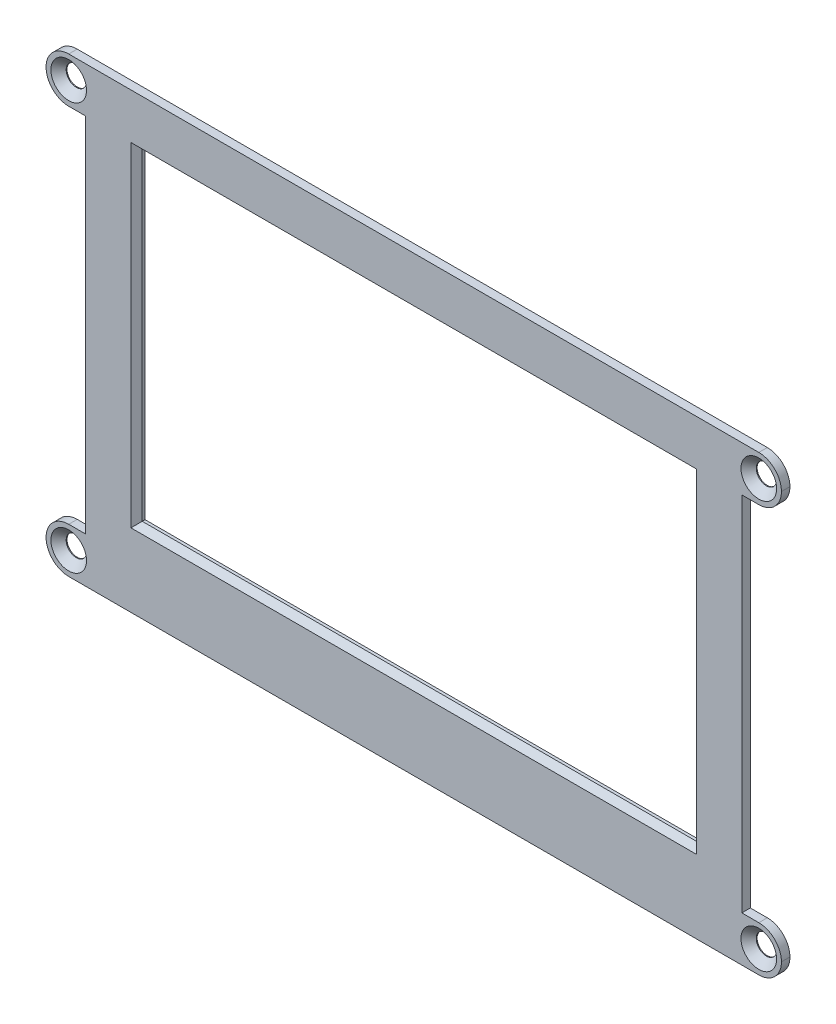
ISO-10303-21;
HEADER;
FILE_DESCRIPTION(('STEP AP214'),'2;1');
FILE_NAME('part.step','',(''),(''),'','','');
FILE_SCHEMA(('AUTOMOTIVE_DESIGN { 1 0 10303 214 1 1 1 1 }'));
ENDSEC;
DATA;
#1=APPLICATION_CONTEXT('core data for automotive mechanical design processes');
#2=APPLICATION_PROTOCOL_DEFINITION('international standard','automotive_design',2000,#1);
#3=PRODUCT_CONTEXT('',#1,'mechanical');
#4=PRODUCT('Part','Part','',(#3));
#5=PRODUCT_RELATED_PRODUCT_CATEGORY('part','',(#4));
#6=PRODUCT_DEFINITION_FORMATION('','',#4);
#7=PRODUCT_DEFINITION_CONTEXT('part definition',#1,'design');
#8=PRODUCT_DEFINITION('design','',#6,#7);
#9=PRODUCT_DEFINITION_SHAPE('','',#8);
#10=(LENGTH_UNIT() NAMED_UNIT(*) SI_UNIT(.MILLI.,.METRE.));
#11=(NAMED_UNIT(*) PLANE_ANGLE_UNIT() SI_UNIT($,.RADIAN.));
#12=(NAMED_UNIT(*) SI_UNIT($,.STERADIAN.) SOLID_ANGLE_UNIT());
#13=UNCERTAINTY_MEASURE_WITH_UNIT(LENGTH_MEASURE(1.E-05),#10,'distance_accuracy_value','');
#14=(GEOMETRIC_REPRESENTATION_CONTEXT(3) GLOBAL_UNCERTAINTY_ASSIGNED_CONTEXT((#13)) GLOBAL_UNIT_ASSIGNED_CONTEXT((#10,
#11,#12)) REPRESENTATION_CONTEXT('',''));
#15=CARTESIAN_POINT('',(0.,0.,0.));
#16=DIRECTION('',(0.,0.,1.));
#17=DIRECTION('',(1.,0.,0.));
#18=AXIS2_PLACEMENT_3D('',#15,#16,#17);
#19=CARTESIAN_POINT('',(0.,0.,1.5));
#20=DIRECTION('',(0.,0.,1.));
#21=DIRECTION('',(1.,0.,0.));
#22=AXIS2_PLACEMENT_3D('',#19,#20,#21);
#23=PLANE('',#22);
#24=DIRECTION('',(-1.,0.,0.));
#25=VECTOR('',#24,1.);
#26=CARTESIAN_POINT('',(-49.,-27.05,1.5));
#27=LINE('',#26,#25);
#28=CARTESIAN_POINT('',(50.,-27.05,1.5));
#29=VERTEX_POINT('',#28);
#30=CARTESIAN_POINT('',(-50.,-27.05,1.5));
#31=VERTEX_POINT('',#30);
#32=EDGE_CURVE('E377',#29,#31,#27,.T.);
#33=ORIENTED_EDGE('',*,*,#32,.T.);
#34=DIRECTION('',(0.,1.,0.));
#35=VECTOR('',#34,1.);
#36=CARTESIAN_POINT('',(-50.,30.95,1.5));
#37=LINE('',#36,#35);
#38=CARTESIAN_POINT('',(-50.,31.95,1.5));
#39=VERTEX_POINT('',#38);
#40=EDGE_CURVE('E383',#31,#39,#37,.T.);
#41=ORIENTED_EDGE('',*,*,#40,.T.);
#42=DIRECTION('',(1.,0.,0.));
#43=VECTOR('',#42,1.);
#44=CARTESIAN_POINT('',(49.,31.95,1.5));
#45=LINE('',#44,#43);
#46=CARTESIAN_POINT('',(50.,31.95,1.5));
#47=VERTEX_POINT('',#46);
#48=EDGE_CURVE('E381',#39,#47,#45,.T.);
#49=ORIENTED_EDGE('',*,*,#48,.T.);
#50=DIRECTION('',(0.,-1.,0.));
#51=VECTOR('',#50,1.);
#52=CARTESIAN_POINT('',(50.,-26.05,1.5));
#53=LINE('',#52,#51);
#54=EDGE_CURVE('E379',#47,#29,#53,.T.);
#55=ORIENTED_EDGE('',*,*,#54,.T.);
#56=EDGE_LOOP('',(#33,#41,#49,#55));
#57=FACE_BOUND('',#56,.T.);
#58=CARTESIAN_POINT('',(61.,-36.,1.5));
#59=DIRECTION('',(0.,0.,1.));
#60=DIRECTION('',(1.,0.,0.));
#61=AXIS2_PLACEMENT_3D('',#58,#59,#60);
#62=CIRCLE('',#61,3.15);
#63=CARTESIAN_POINT('',(64.15,-36.,1.5));
#64=VERTEX_POINT('',#63);
#65=EDGE_CURVE('E231',#64,#64,#62,.T.);
#66=ORIENTED_EDGE('',*,*,#65,.F.);
#67=EDGE_LOOP('',(#66));
#68=FACE_BOUND('',#67,.T.);
#69=CARTESIAN_POINT('',(-61.,-36.,1.5));
#70=DIRECTION('',(0.,0.,1.));
#71=DIRECTION('',(1.,0.,0.));
#72=AXIS2_PLACEMENT_3D('',#69,#70,#71);
#73=CIRCLE('',#72,3.15);
#74=CARTESIAN_POINT('',(-57.85,-36.,1.5));
#75=VERTEX_POINT('',#74);
#76=EDGE_CURVE('E245',#75,#75,#73,.T.);
#77=ORIENTED_EDGE('',*,*,#76,.F.);
#78=EDGE_LOOP('',(#77));
#79=FACE_BOUND('',#78,.T.);
#80=CARTESIAN_POINT('',(61.,36.,1.5));
#81=DIRECTION('',(0.,0.,1.));
#82=DIRECTION('',(1.,0.,0.));
#83=AXIS2_PLACEMENT_3D('',#80,#81,#82);
#84=CIRCLE('',#83,3.15);
#85=CARTESIAN_POINT('',(64.15,36.,1.5));
#86=VERTEX_POINT('',#85);
#87=EDGE_CURVE('E254',#86,#86,#84,.T.);
#88=ORIENTED_EDGE('',*,*,#87,.F.);
#89=EDGE_LOOP('',(#88));
#90=FACE_BOUND('',#89,.T.);
#91=CARTESIAN_POINT('',(-61.,36.,1.5));
#92=DIRECTION('',(0.,0.,1.));
#93=DIRECTION('',(1.,0.,0.));
#94=AXIS2_PLACEMENT_3D('',#91,#92,#93);
#95=CIRCLE('',#94,3.15);
#96=CARTESIAN_POINT('',(-57.85,36.,1.5));
#97=VERTEX_POINT('',#96);
#98=EDGE_CURVE('E263',#97,#97,#95,.T.);
#99=ORIENTED_EDGE('',*,*,#98,.F.);
#100=EDGE_LOOP('',(#99));
#101=FACE_BOUND('',#100,.T.);
#102=DIRECTION('',(-1.,0.,0.));
#103=VECTOR('',#102,1.);
#104=CARTESIAN_POINT('',(-58.,-32.,1.5));
#105=LINE('',#104,#103);
#106=CARTESIAN_POINT('',(-58.,-32.,1.5));
#107=VERTEX_POINT('',#106);
#108=CARTESIAN_POINT('',(-61.,-32.,1.5));
#109=VERTEX_POINT('',#108);
#110=EDGE_CURVE('E194',#107,#109,#105,.T.);
#111=ORIENTED_EDGE('',*,*,#110,.T.);
#112=CARTESIAN_POINT('',(-61.,-36.,1.5));
#113=DIRECTION('',(0.,0.,1.));
#114=DIRECTION('',(1.,0.,0.));
#115=AXIS2_PLACEMENT_3D('',#112,#113,#114);
#116=CIRCLE('',#115,4.);
#117=CARTESIAN_POINT('',(-65.,-36.,1.5));
#118=VERTEX_POINT('',#117);
#119=EDGE_CURVE('E357',#109,#118,#116,.T.);
#120=ORIENTED_EDGE('',*,*,#119,.T.);
#121=CARTESIAN_POINT('',(-61.,-36.,1.5));
#122=DIRECTION('',(0.,0.,1.));
#123=DIRECTION('',(1.,0.,0.));
#124=AXIS2_PLACEMENT_3D('',#121,#122,#123);
#125=CIRCLE('',#124,4.);
#126=CARTESIAN_POINT('',(-61.,-40.,1.5));
#127=VERTEX_POINT('',#126);
#128=EDGE_CURVE('E307',#118,#127,#125,.T.);
#129=ORIENTED_EDGE('',*,*,#128,.T.);
#130=DIRECTION('',(1.,0.,0.));
#131=VECTOR('',#130,1.);
#132=CARTESIAN_POINT('',(-65.,-40.,1.5));
#133=LINE('',#132,#131);
#134=CARTESIAN_POINT('',(61.,-40.,1.5));
#135=VERTEX_POINT('',#134);
#136=EDGE_CURVE('E276',#127,#135,#133,.T.);
#137=ORIENTED_EDGE('',*,*,#136,.T.);
#138=CARTESIAN_POINT('',(61.,-36.,1.5));
#139=DIRECTION('',(0.,0.,1.));
#140=DIRECTION('',(1.,0.,0.));
#141=AXIS2_PLACEMENT_3D('',#138,#139,#140);
#142=CIRCLE('',#141,4.);
#143=CARTESIAN_POINT('',(65.,-36.,1.5));
#144=VERTEX_POINT('',#143);
#145=EDGE_CURVE('E309',#135,#144,#142,.T.);
#146=ORIENTED_EDGE('',*,*,#145,.T.);
#147=CARTESIAN_POINT('',(61.,-36.,1.5));
#148=DIRECTION('',(0.,0.,1.));
#149=DIRECTION('',(1.,0.,0.));
#150=AXIS2_PLACEMENT_3D('',#147,#148,#149);
#151=CIRCLE('',#150,4.);
#152=CARTESIAN_POINT('',(61.,-32.,1.5));
#153=VERTEX_POINT('',#152);
#154=EDGE_CURVE('E354',#144,#153,#151,.T.);
#155=ORIENTED_EDGE('',*,*,#154,.T.);
#156=DIRECTION('',(1.,0.,0.));
#157=VECTOR('',#156,1.);
#158=CARTESIAN_POINT('',(58.,-32.,1.5));
#159=LINE('',#158,#157);
#160=CARTESIAN_POINT('',(58.,-32.,1.5));
#161=VERTEX_POINT('',#160);
#162=EDGE_CURVE('E217',#161,#153,#159,.T.);
#163=ORIENTED_EDGE('',*,*,#162,.F.);
#164=DIRECTION('',(0.,-1.,0.));
#165=VECTOR('',#164,1.);
#166=CARTESIAN_POINT('',(58.,32.,1.5));
#167=LINE('',#166,#165);
#168=CARTESIAN_POINT('',(58.,32.,1.5));
#169=VERTEX_POINT('',#168);
#170=EDGE_CURVE('E213',#169,#161,#167,.T.);
#171=ORIENTED_EDGE('',*,*,#170,.F.);
#172=DIRECTION('',(-1.,0.,0.));
#173=VECTOR('',#172,1.);
#174=CARTESIAN_POINT('',(58.,32.,1.5));
#175=LINE('',#174,#173);
#176=CARTESIAN_POINT('',(61.,32.,1.5));
#177=VERTEX_POINT('',#176);
#178=EDGE_CURVE('E220',#177,#169,#175,.T.);
#179=ORIENTED_EDGE('',*,*,#178,.F.);
#180=CARTESIAN_POINT('',(61.,36.,1.5));
#181=DIRECTION('',(0.,0.,1.));
#182=DIRECTION('',(1.,0.,0.));
#183=AXIS2_PLACEMENT_3D('',#180,#181,#182);
#184=CIRCLE('',#183,4.);
#185=CARTESIAN_POINT('',(65.,36.,1.5));
#186=VERTEX_POINT('',#185);
#187=EDGE_CURVE('E352',#177,#186,#184,.T.);
#188=ORIENTED_EDGE('',*,*,#187,.T.);
#189=CARTESIAN_POINT('',(61.,36.,1.5));
#190=DIRECTION('',(0.,0.,1.));
#191=DIRECTION('',(1.,0.,0.));
#192=AXIS2_PLACEMENT_3D('',#189,#190,#191);
#193=CIRCLE('',#192,4.);
#194=CARTESIAN_POINT('',(61.,40.,1.5));
#195=VERTEX_POINT('',#194);
#196=EDGE_CURVE('E305',#186,#195,#193,.T.);
#197=ORIENTED_EDGE('',*,*,#196,.T.);
#198=DIRECTION('',(-1.,0.,0.));
#199=VECTOR('',#198,1.);
#200=CARTESIAN_POINT('',(-65.,40.,1.5));
#201=LINE('',#200,#199);
#202=CARTESIAN_POINT('',(-61.,40.,1.5));
#203=VERTEX_POINT('',#202);
#204=EDGE_CURVE('E273',#195,#203,#201,.T.);
#205=ORIENTED_EDGE('',*,*,#204,.T.);
#206=CARTESIAN_POINT('',(-61.,36.,1.5));
#207=DIRECTION('',(0.,0.,1.));
#208=DIRECTION('',(1.,0.,0.));
#209=AXIS2_PLACEMENT_3D('',#206,#207,#208);
#210=CIRCLE('',#209,4.);
#211=CARTESIAN_POINT('',(-65.,36.,1.5));
#212=VERTEX_POINT('',#211);
#213=EDGE_CURVE('E303',#203,#212,#210,.T.);
#214=ORIENTED_EDGE('',*,*,#213,.T.);
#215=CARTESIAN_POINT('',(-61.,36.,1.5));
#216=DIRECTION('',(0.,0.,1.));
#217=DIRECTION('',(1.,0.,0.));
#218=AXIS2_PLACEMENT_3D('',#215,#216,#217);
#219=CIRCLE('',#218,4.);
#220=CARTESIAN_POINT('',(-61.,32.,1.5));
#221=VERTEX_POINT('',#220);
#222=EDGE_CURVE('E191',#212,#221,#219,.T.);
#223=ORIENTED_EDGE('',*,*,#222,.T.);
#224=DIRECTION('',(1.,0.,0.));
#225=VECTOR('',#224,1.);
#226=CARTESIAN_POINT('',(-58.,32.,1.5));
#227=LINE('',#226,#225);
#228=CARTESIAN_POINT('',(-58.,32.,1.5));
#229=VERTEX_POINT('',#228);
#230=EDGE_CURVE('E185',#221,#229,#227,.T.);
#231=ORIENTED_EDGE('',*,*,#230,.T.);
#232=DIRECTION('',(0.,-1.,0.));
#233=VECTOR('',#232,1.);
#234=CARTESIAN_POINT('',(-58.,32.,1.5));
#235=LINE('',#234,#233);
#236=EDGE_CURVE('E189',#229,#107,#235,.T.);
#237=ORIENTED_EDGE('',*,*,#236,.T.);
#238=EDGE_LOOP('',(#111,#120,#129,#137,#146,#155,#163,#171,#179,#188,#197,#205,#214,#223,#231,#237));
#239=FACE_BOUND('',#238,.T.);
#240=ADVANCED_FACE('F35',(#57,#68,#79,#90,#101,#239),#23,.T.);
#241=CARTESIAN_POINT('',(0.,0.,0.));
#242=DIRECTION('',(0.,0.,1.));
#243=DIRECTION('',(1.,0.,0.));
#244=AXIS2_PLACEMENT_3D('',#241,#242,#243);
#245=PLANE('',#244);
#246=CARTESIAN_POINT('',(-61.,36.,0.));
#247=DIRECTION('',(0.,0.,1.));
#248=DIRECTION('',(1.,0.,0.));
#249=AXIS2_PLACEMENT_3D('',#246,#247,#248);
#250=CIRCLE('',#249,1.8);
#251=CARTESIAN_POINT('',(-59.2,36.,0.));
#252=VERTEX_POINT('',#251);
#253=EDGE_CURVE('E269',#252,#252,#250,.T.);
#254=ORIENTED_EDGE('',*,*,#253,.T.);
#255=EDGE_LOOP('',(#254));
#256=FACE_BOUND('',#255,.T.);
#257=CARTESIAN_POINT('',(61.,36.,0.));
#258=DIRECTION('',(0.,0.,1.));
#259=DIRECTION('',(1.,0.,0.));
#260=AXIS2_PLACEMENT_3D('',#257,#258,#259);
#261=CIRCLE('',#260,1.8);
#262=CARTESIAN_POINT('',(62.8,36.,0.));
#263=VERTEX_POINT('',#262);
#264=EDGE_CURVE('E260',#263,#263,#261,.T.);
#265=ORIENTED_EDGE('',*,*,#264,.T.);
#266=EDGE_LOOP('',(#265));
#267=FACE_BOUND('',#266,.T.);
#268=CARTESIAN_POINT('',(-61.,-36.,0.));
#269=DIRECTION('',(0.,0.,1.));
#270=DIRECTION('',(1.,0.,0.));
#271=AXIS2_PLACEMENT_3D('',#268,#269,#270);
#272=CIRCLE('',#271,1.8);
#273=CARTESIAN_POINT('',(-59.2,-36.,0.));
#274=VERTEX_POINT('',#273);
#275=EDGE_CURVE('E251',#274,#274,#272,.T.);
#276=ORIENTED_EDGE('',*,*,#275,.T.);
#277=EDGE_LOOP('',(#276));
#278=FACE_BOUND('',#277,.T.);
#279=CARTESIAN_POINT('',(61.,-36.,0.));
#280=DIRECTION('',(0.,0.,1.));
#281=DIRECTION('',(1.,0.,0.));
#282=AXIS2_PLACEMENT_3D('',#279,#280,#281);
#283=CIRCLE('',#282,1.8);
#284=CARTESIAN_POINT('',(62.8,-36.,0.));
#285=VERTEX_POINT('',#284);
#286=EDGE_CURVE('E242',#285,#285,#283,.T.);
#287=ORIENTED_EDGE('',*,*,#286,.T.);
#288=EDGE_LOOP('',(#287));
#289=FACE_BOUND('',#288,.T.);
#290=DIRECTION('',(-1.,0.,0.));
#291=VECTOR('',#290,1.);
#292=CARTESIAN_POINT('',(0.,30.95,0.));
#293=LINE('',#292,#291);
#294=CARTESIAN_POINT('',(49.,30.95,0.));
#295=VERTEX_POINT('',#294);
#296=CARTESIAN_POINT('',(-49.,30.95,0.));
#297=VERTEX_POINT('',#296);
#298=EDGE_CURVE('E329',#295,#297,#293,.T.);
#299=ORIENTED_EDGE('',*,*,#298,.T.);
#300=DIRECTION('',(0.,-1.,0.));
#301=VECTOR('',#300,1.);
#302=CARTESIAN_POINT('',(-49.,0.,0.));
#303=LINE('',#302,#301);
#304=CARTESIAN_POINT('',(-49.,-26.05,0.));
#305=VERTEX_POINT('',#304);
#306=EDGE_CURVE('E332',#297,#305,#303,.T.);
#307=ORIENTED_EDGE('',*,*,#306,.T.);
#308=DIRECTION('',(1.,0.,0.));
#309=VECTOR('',#308,1.);
#310=CARTESIAN_POINT('',(0.,-26.05,0.));
#311=LINE('',#310,#309);
#312=CARTESIAN_POINT('',(49.,-26.05,0.));
#313=VERTEX_POINT('',#312);
#314=EDGE_CURVE('E323',#305,#313,#311,.T.);
#315=ORIENTED_EDGE('',*,*,#314,.T.);
#316=DIRECTION('',(0.,1.,0.));
#317=VECTOR('',#316,1.);
#318=CARTESIAN_POINT('',(49.,0.,0.));
#319=LINE('',#318,#317);
#320=EDGE_CURVE('E326',#313,#295,#319,.T.);
#321=ORIENTED_EDGE('',*,*,#320,.T.);
#322=EDGE_LOOP('',(#299,#307,#315,#321));
#323=FACE_BOUND('',#322,.T.);
#324=CARTESIAN_POINT('',(-61.,-36.,0.));
#325=DIRECTION('',(0.,0.,1.));
#326=DIRECTION('',(1.,0.,0.));
#327=AXIS2_PLACEMENT_3D('',#324,#325,#326);
#328=CIRCLE('',#327,4.);
#329=CARTESIAN_POINT('',(-61.,-40.,0.));
#330=VERTEX_POINT('',#329);
#331=CARTESIAN_POINT('',(-65.,-36.,0.));
#332=VERTEX_POINT('',#331);
#333=EDGE_CURVE('E294',#330,#332,#328,.F.);
#334=ORIENTED_EDGE('',*,*,#333,.T.);
#335=CARTESIAN_POINT('',(-61.,-36.,0.));
#336=DIRECTION('',(0.,0.,1.));
#337=DIRECTION('',(1.,0.,0.));
#338=AXIS2_PLACEMENT_3D('',#335,#336,#337);
#339=CIRCLE('',#338,4.);
#340=CARTESIAN_POINT('',(-61.,-32.,0.));
#341=VERTEX_POINT('',#340);
#342=EDGE_CURVE('E365',#332,#341,#339,.F.);
#343=ORIENTED_EDGE('',*,*,#342,.T.);
#344=DIRECTION('',(-1.,0.,0.));
#345=VECTOR('',#344,1.);
#346=CARTESIAN_POINT('',(0.,-32.,0.));
#347=LINE('',#346,#345);
#348=CARTESIAN_POINT('',(-58.,-32.,0.));
#349=VERTEX_POINT('',#348);
#350=EDGE_CURVE('E346',#349,#341,#347,.T.);
#351=ORIENTED_EDGE('',*,*,#350,.F.);
#352=DIRECTION('',(0.,-1.,0.));
#353=VECTOR('',#352,1.);
#354=CARTESIAN_POINT('',(-58.,0.,0.));
#355=LINE('',#354,#353);
#356=CARTESIAN_POINT('',(-58.,32.,0.));
#357=VERTEX_POINT('',#356);
#358=EDGE_CURVE('E344',#357,#349,#355,.T.);
#359=ORIENTED_EDGE('',*,*,#358,.F.);
#360=DIRECTION('',(1.,0.,0.));
#361=VECTOR('',#360,1.);
#362=CARTESIAN_POINT('',(0.,32.,0.));
#363=LINE('',#362,#361);
#364=CARTESIAN_POINT('',(-61.,32.,0.));
#365=VERTEX_POINT('',#364);
#366=EDGE_CURVE('E200',#365,#357,#363,.T.);
#367=ORIENTED_EDGE('',*,*,#366,.F.);
#368=CARTESIAN_POINT('',(-61.,36.,0.));
#369=DIRECTION('',(0.,0.,1.));
#370=DIRECTION('',(1.,0.,0.));
#371=AXIS2_PLACEMENT_3D('',#368,#369,#370);
#372=CIRCLE('',#371,4.);
#373=CARTESIAN_POINT('',(-65.,36.,0.));
#374=VERTEX_POINT('',#373);
#375=EDGE_CURVE('E363',#365,#374,#372,.F.);
#376=ORIENTED_EDGE('',*,*,#375,.T.);
#377=CARTESIAN_POINT('',(-61.,36.,0.));
#378=DIRECTION('',(0.,0.,1.));
#379=DIRECTION('',(1.,0.,0.));
#380=AXIS2_PLACEMENT_3D('',#377,#378,#379);
#381=CIRCLE('',#380,4.);
#382=CARTESIAN_POINT('',(-61.,40.,0.));
#383=VERTEX_POINT('',#382);
#384=EDGE_CURVE('E290',#374,#383,#381,.F.);
#385=ORIENTED_EDGE('',*,*,#384,.T.);
#386=DIRECTION('',(-1.,0.,0.));
#387=VECTOR('',#386,1.);
#388=CARTESIAN_POINT('',(-65.,40.,0.));
#389=LINE('',#388,#387);
#390=CARTESIAN_POINT('',(61.,40.,0.));
#391=VERTEX_POINT('',#390);
#392=EDGE_CURVE('E272',#391,#383,#389,.T.);
#393=ORIENTED_EDGE('',*,*,#392,.F.);
#394=CARTESIAN_POINT('',(61.,36.,0.));
#395=DIRECTION('',(0.,0.,1.));
#396=DIRECTION('',(1.,0.,0.));
#397=AXIS2_PLACEMENT_3D('',#394,#395,#396);
#398=CIRCLE('',#397,4.);
#399=CARTESIAN_POINT('',(65.,36.,0.));
#400=VERTEX_POINT('',#399);
#401=EDGE_CURVE('E292',#391,#400,#398,.F.);
#402=ORIENTED_EDGE('',*,*,#401,.T.);
#403=CARTESIAN_POINT('',(61.,36.,0.));
#404=DIRECTION('',(0.,0.,1.));
#405=DIRECTION('',(1.,0.,0.));
#406=AXIS2_PLACEMENT_3D('',#403,#404,#405);
#407=CIRCLE('',#406,4.);
#408=CARTESIAN_POINT('',(61.,32.,0.));
#409=VERTEX_POINT('',#408);
#410=EDGE_CURVE('E359',#400,#409,#407,.F.);
#411=ORIENTED_EDGE('',*,*,#410,.T.);
#412=DIRECTION('',(-1.,0.,0.));
#413=VECTOR('',#412,1.);
#414=CARTESIAN_POINT('',(0.,32.,0.));
#415=LINE('',#414,#413);
#416=CARTESIAN_POINT('',(58.,32.,0.));
#417=VERTEX_POINT('',#416);
#418=EDGE_CURVE('E341',#409,#417,#415,.T.);
#419=ORIENTED_EDGE('',*,*,#418,.T.);
#420=DIRECTION('',(0.,-1.,0.));
#421=VECTOR('',#420,1.);
#422=CARTESIAN_POINT('',(58.,0.,0.));
#423=LINE('',#422,#421);
#424=CARTESIAN_POINT('',(58.,-32.,0.));
#425=VERTEX_POINT('',#424);
#426=EDGE_CURVE('E338',#417,#425,#423,.T.);
#427=ORIENTED_EDGE('',*,*,#426,.T.);
#428=DIRECTION('',(1.,0.,0.));
#429=VECTOR('',#428,1.);
#430=CARTESIAN_POINT('',(0.,-32.,0.));
#431=LINE('',#430,#429);
#432=CARTESIAN_POINT('',(61.,-32.,0.));
#433=VERTEX_POINT('',#432);
#434=EDGE_CURVE('E335',#425,#433,#431,.T.);
#435=ORIENTED_EDGE('',*,*,#434,.T.);
#436=CARTESIAN_POINT('',(61.,-36.,0.));
#437=DIRECTION('',(0.,0.,1.));
#438=DIRECTION('',(1.,0.,0.));
#439=AXIS2_PLACEMENT_3D('',#436,#437,#438);
#440=CIRCLE('',#439,4.);
#441=CARTESIAN_POINT('',(65.,-36.,0.));
#442=VERTEX_POINT('',#441);
#443=EDGE_CURVE('E361',#433,#442,#440,.F.);
#444=ORIENTED_EDGE('',*,*,#443,.T.);
#445=CARTESIAN_POINT('',(61.,-36.,0.));
#446=DIRECTION('',(0.,0.,1.));
#447=DIRECTION('',(1.,0.,0.));
#448=AXIS2_PLACEMENT_3D('',#445,#446,#447);
#449=CIRCLE('',#448,4.);
#450=CARTESIAN_POINT('',(61.,-40.,0.));
#451=VERTEX_POINT('',#450);
#452=EDGE_CURVE('E296',#442,#451,#449,.F.);
#453=ORIENTED_EDGE('',*,*,#452,.T.);
#454=DIRECTION('',(1.,0.,0.));
#455=VECTOR('',#454,1.);
#456=CARTESIAN_POINT('',(-65.,-40.,0.));
#457=LINE('',#456,#455);
#458=EDGE_CURVE('E277',#330,#451,#457,.T.);
#459=ORIENTED_EDGE('',*,*,#458,.F.);
#460=EDGE_LOOP('',(#334,#343,#351,#359,#367,#376,#385,#393,#402,#411,#419,#427,#435,#444,#453,#459));
#461=FACE_BOUND('',#460,.T.);
#462=ADVANCED_FACE('F414',(#256,#267,#278,#289,#323,#461),#245,.F.);
#463=CARTESIAN_POINT('',(-65.,40.,1.5));
#464=DIRECTION('',(0.,-1.,0.));
#465=DIRECTION('',(0.,0.,-1.));
#466=AXIS2_PLACEMENT_3D('',#463,#464,#465);
#467=PLANE('',#466);
#468=ORIENTED_EDGE('',*,*,#204,.F.);
#469=DIRECTION('',(0.,0.,-1.));
#470=VECTOR('',#469,1.);
#471=CARTESIAN_POINT('',(61.,40.,1.5));
#472=LINE('',#471,#470);
#473=EDGE_CURVE('E320',#195,#391,#472,.T.);
#474=ORIENTED_EDGE('',*,*,#473,.T.);
#475=ORIENTED_EDGE('',*,*,#392,.T.);
#476=DIRECTION('',(0.,0.,-1.));
#477=VECTOR('',#476,1.);
#478=CARTESIAN_POINT('',(-61.,40.,1.5));
#479=LINE('',#478,#477);
#480=EDGE_CURVE('E318',#383,#203,#479,.F.);
#481=ORIENTED_EDGE('',*,*,#480,.T.);
#482=EDGE_LOOP('',(#468,#474,#475,#481));
#483=FACE_BOUND('',#482,.T.);
#484=ADVANCED_FACE('F437',(#483),#467,.F.);
#485=CARTESIAN_POINT('',(-65.,-40.,1.5));
#486=DIRECTION('',(0.,1.,0.));
#487=DIRECTION('',(0.,0.,1.));
#488=AXIS2_PLACEMENT_3D('',#485,#486,#487);
#489=PLANE('',#488);
#490=ORIENTED_EDGE('',*,*,#458,.T.);
#491=DIRECTION('',(0.,0.,-1.));
#492=VECTOR('',#491,1.);
#493=CARTESIAN_POINT('',(61.,-40.,1.5));
#494=LINE('',#493,#492);
#495=EDGE_CURVE('E301',#451,#135,#494,.F.);
#496=ORIENTED_EDGE('',*,*,#495,.T.);
#497=ORIENTED_EDGE('',*,*,#136,.F.);
#498=DIRECTION('',(0.,0.,-1.));
#499=VECTOR('',#498,1.);
#500=CARTESIAN_POINT('',(-61.,-40.,1.5));
#501=LINE('',#500,#499);
#502=EDGE_CURVE('E298',#127,#330,#501,.T.);
#503=ORIENTED_EDGE('',*,*,#502,.T.);
#504=EDGE_LOOP('',(#490,#496,#497,#503));
#505=FACE_BOUND('',#504,.T.);
#506=ADVANCED_FACE('F445',(#505),#489,.F.);
#507=CARTESIAN_POINT('',(61.,-36.,1.5));
#508=DIRECTION('',(0.,0.,-1.));
#509=DIRECTION('',(-1.,0.,0.));
#510=AXIS2_PLACEMENT_3D('',#507,#508,#509);
#511=CYLINDRICAL_SURFACE('',#510,4.);
#512=ORIENTED_EDGE('',*,*,#145,.F.);
#513=ORIENTED_EDGE('',*,*,#495,.F.);
#514=ORIENTED_EDGE('',*,*,#452,.F.);
#515=DIRECTION('',(0.,0.,-1.));
#516=VECTOR('',#515,1.);
#517=CARTESIAN_POINT('',(65.,-36.,1.5));
#518=LINE('',#517,#516);
#519=EDGE_CURVE('E287',#144,#442,#518,.T.);
#520=ORIENTED_EDGE('',*,*,#519,.F.);
#521=EDGE_LOOP('',(#512,#513,#514,#520));
#522=FACE_BOUND('',#521,.T.);
#523=ADVANCED_FACE('F448',(#522),#511,.T.);
#524=CARTESIAN_POINT('',(-61.,-36.,1.5));
#525=DIRECTION('',(0.,0.,-1.));
#526=DIRECTION('',(-1.,0.,0.));
#527=AXIS2_PLACEMENT_3D('',#524,#525,#526);
#528=CYLINDRICAL_SURFACE('',#527,4.);
#529=ORIENTED_EDGE('',*,*,#128,.F.);
#530=DIRECTION('',(0.,0.,-1.));
#531=VECTOR('',#530,1.);
#532=CARTESIAN_POINT('',(-65.,-36.,1.5));
#533=LINE('',#532,#531);
#534=EDGE_CURVE('E315',#332,#118,#533,.F.);
#535=ORIENTED_EDGE('',*,*,#534,.F.);
#536=ORIENTED_EDGE('',*,*,#333,.F.);
#537=ORIENTED_EDGE('',*,*,#502,.F.);
#538=EDGE_LOOP('',(#529,#535,#536,#537));
#539=FACE_BOUND('',#538,.T.);
#540=ADVANCED_FACE('F455',(#539),#528,.T.);
#541=CARTESIAN_POINT('',(61.,36.,1.5));
#542=DIRECTION('',(0.,0.,-1.));
#543=DIRECTION('',(-1.,0.,0.));
#544=AXIS2_PLACEMENT_3D('',#541,#542,#543);
#545=CYLINDRICAL_SURFACE('',#544,4.);
#546=ORIENTED_EDGE('',*,*,#196,.F.);
#547=DIRECTION('',(0.,0.,-1.));
#548=VECTOR('',#547,1.);
#549=CARTESIAN_POINT('',(65.,36.,1.5));
#550=LINE('',#549,#548);
#551=EDGE_CURVE('E280',#400,#186,#550,.F.);
#552=ORIENTED_EDGE('',*,*,#551,.F.);
#553=ORIENTED_EDGE('',*,*,#401,.F.);
#554=ORIENTED_EDGE('',*,*,#473,.F.);
#555=EDGE_LOOP('',(#546,#552,#553,#554));
#556=FACE_BOUND('',#555,.T.);
#557=ADVANCED_FACE('F459',(#556),#545,.T.);
#558=CARTESIAN_POINT('',(-61.,36.,1.5));
#559=DIRECTION('',(0.,0.,-1.));
#560=DIRECTION('',(-1.,0.,0.));
#561=AXIS2_PLACEMENT_3D('',#558,#559,#560);
#562=CYLINDRICAL_SURFACE('',#561,4.);
#563=ORIENTED_EDGE('',*,*,#213,.F.);
#564=ORIENTED_EDGE('',*,*,#480,.F.);
#565=ORIENTED_EDGE('',*,*,#384,.F.);
#566=DIRECTION('',(0.,0.,-1.));
#567=VECTOR('',#566,1.);
#568=CARTESIAN_POINT('',(-65.,36.,1.5));
#569=LINE('',#568,#567);
#570=EDGE_CURVE('E312',#212,#374,#569,.T.);
#571=ORIENTED_EDGE('',*,*,#570,.F.);
#572=EDGE_LOOP('',(#563,#564,#565,#571));
#573=FACE_BOUND('',#572,.T.);
#574=ADVANCED_FACE('F463',(#573),#562,.T.);
#575=CARTESIAN_POINT('',(-61.,36.,1.5));
#576=DIRECTION('',(0.,0.,1.));
#577=DIRECTION('',(1.,0.,0.));
#578=AXIS2_PLACEMENT_3D('',#575,#576,#577);
#579=CYLINDRICAL_SURFACE('',#578,1.8);
#580=ORIENTED_EDGE('',*,*,#253,.F.);
#581=EDGE_LOOP('',(#580));
#582=FACE_BOUND('',#581,.T.);
#583=CARTESIAN_POINT('',(-61.,36.,0.15));
#584=DIRECTION('',(0.,0.,1.));
#585=DIRECTION('',(1.,0.,0.));
#586=AXIS2_PLACEMENT_3D('',#583,#584,#585);
#587=CIRCLE('',#586,1.8);
#588=CARTESIAN_POINT('',(-59.2,36.,0.15));
#589=VERTEX_POINT('',#588);
#590=EDGE_CURVE('E266',#589,#589,#587,.T.);
#591=ORIENTED_EDGE('',*,*,#590,.T.);
#592=EDGE_LOOP('',(#591));
#593=FACE_BOUND('',#592,.T.);
#594=ADVANCED_FACE('F442',(#582,#593),#579,.F.);
#595=CARTESIAN_POINT('',(-61.,36.,1.5));
#596=DIRECTION('',(0.,0.,1.));
#597=DIRECTION('',(1.,0.,0.));
#598=AXIS2_PLACEMENT_3D('',#595,#596,#597);
#599=CONICAL_SURFACE('',#598,3.15,0.78539816339745);
#600=ORIENTED_EDGE('',*,*,#590,.F.);
#601=EDGE_LOOP('',(#600));
#602=FACE_BOUND('',#601,.T.);
#603=ORIENTED_EDGE('',*,*,#98,.T.);
#604=EDGE_LOOP('',(#603));
#605=FACE_BOUND('',#604,.T.);
#606=ADVANCED_FACE('F615',(#602,#605),#599,.F.);
#607=CARTESIAN_POINT('',(61.,36.,1.5));
#608=DIRECTION('',(0.,0.,1.));
#609=DIRECTION('',(1.,0.,0.));
#610=AXIS2_PLACEMENT_3D('',#607,#608,#609);
#611=CYLINDRICAL_SURFACE('',#610,1.8);
#612=ORIENTED_EDGE('',*,*,#264,.F.);
#613=EDGE_LOOP('',(#612));
#614=FACE_BOUND('',#613,.T.);
#615=CARTESIAN_POINT('',(61.,36.,0.15));
#616=DIRECTION('',(0.,0.,1.));
#617=DIRECTION('',(1.,0.,0.));
#618=AXIS2_PLACEMENT_3D('',#615,#616,#617);
#619=CIRCLE('',#618,1.8);
#620=CARTESIAN_POINT('',(62.8,36.,0.15));
#621=VERTEX_POINT('',#620);
#622=EDGE_CURVE('E257',#621,#621,#619,.T.);
#623=ORIENTED_EDGE('',*,*,#622,.T.);
#624=EDGE_LOOP('',(#623));
#625=FACE_BOUND('',#624,.T.);
#626=ADVANCED_FACE('F605',(#614,#625),#611,.F.);
#627=CARTESIAN_POINT('',(61.,36.,1.5));
#628=DIRECTION('',(0.,0.,1.));
#629=DIRECTION('',(1.,0.,0.));
#630=AXIS2_PLACEMENT_3D('',#627,#628,#629);
#631=CONICAL_SURFACE('',#630,3.15,0.78539816339745);
#632=ORIENTED_EDGE('',*,*,#622,.F.);
#633=EDGE_LOOP('',(#632));
#634=FACE_BOUND('',#633,.T.);
#635=ORIENTED_EDGE('',*,*,#87,.T.);
#636=EDGE_LOOP('',(#635));
#637=FACE_BOUND('',#636,.T.);
#638=ADVANCED_FACE('F595',(#634,#637),#631,.F.);
#639=CARTESIAN_POINT('',(-61.,-36.,1.5));
#640=DIRECTION('',(0.,0.,1.));
#641=DIRECTION('',(1.,0.,0.));
#642=AXIS2_PLACEMENT_3D('',#639,#640,#641);
#643=CYLINDRICAL_SURFACE('',#642,1.8);
#644=ORIENTED_EDGE('',*,*,#275,.F.);
#645=EDGE_LOOP('',(#644));
#646=FACE_BOUND('',#645,.T.);
#647=CARTESIAN_POINT('',(-61.,-36.,0.15));
#648=DIRECTION('',(0.,0.,1.));
#649=DIRECTION('',(1.,0.,0.));
#650=AXIS2_PLACEMENT_3D('',#647,#648,#649);
#651=CIRCLE('',#650,1.8);
#652=CARTESIAN_POINT('',(-59.2,-36.,0.15));
#653=VERTEX_POINT('',#652);
#654=EDGE_CURVE('E248',#653,#653,#651,.T.);
#655=ORIENTED_EDGE('',*,*,#654,.T.);
#656=EDGE_LOOP('',(#655));
#657=FACE_BOUND('',#656,.T.);
#658=ADVANCED_FACE('F585',(#646,#657),#643,.F.);
#659=CARTESIAN_POINT('',(-61.,-36.,1.5));
#660=DIRECTION('',(0.,0.,1.));
#661=DIRECTION('',(1.,0.,0.));
#662=AXIS2_PLACEMENT_3D('',#659,#660,#661);
#663=CONICAL_SURFACE('',#662,3.15,0.78539816339745);
#664=ORIENTED_EDGE('',*,*,#654,.F.);
#665=EDGE_LOOP('',(#664));
#666=FACE_BOUND('',#665,.T.);
#667=ORIENTED_EDGE('',*,*,#76,.T.);
#668=EDGE_LOOP('',(#667));
#669=FACE_BOUND('',#668,.T.);
#670=ADVANCED_FACE('F575',(#666,#669),#663,.F.);
#671=CARTESIAN_POINT('',(61.,-36.,1.5));
#672=DIRECTION('',(0.,0.,1.));
#673=DIRECTION('',(1.,0.,0.));
#674=AXIS2_PLACEMENT_3D('',#671,#672,#673);
#675=CYLINDRICAL_SURFACE('',#674,1.8);
#676=ORIENTED_EDGE('',*,*,#286,.F.);
#677=EDGE_LOOP('',(#676));
#678=FACE_BOUND('',#677,.T.);
#679=CARTESIAN_POINT('',(61.,-36.,0.15));
#680=DIRECTION('',(0.,0.,1.));
#681=DIRECTION('',(1.,0.,0.));
#682=AXIS2_PLACEMENT_3D('',#679,#680,#681);
#683=CIRCLE('',#682,1.8);
#684=CARTESIAN_POINT('',(62.8,-36.,0.15));
#685=VERTEX_POINT('',#684);
#686=EDGE_CURVE('E239',#685,#685,#683,.T.);
#687=ORIENTED_EDGE('',*,*,#686,.T.);
#688=EDGE_LOOP('',(#687));
#689=FACE_BOUND('',#688,.T.);
#690=ADVANCED_FACE('F563',(#678,#689),#675,.F.);
#691=CARTESIAN_POINT('',(61.,-36.,1.5));
#692=DIRECTION('',(0.,0.,1.));
#693=DIRECTION('',(1.,0.,0.));
#694=AXIS2_PLACEMENT_3D('',#691,#692,#693);
#695=CONICAL_SURFACE('',#694,3.15,0.78539816339745);
#696=ORIENTED_EDGE('',*,*,#686,.F.);
#697=EDGE_LOOP('',(#696));
#698=FACE_BOUND('',#697,.T.);
#699=ORIENTED_EDGE('',*,*,#65,.T.);
#700=EDGE_LOOP('',(#699));
#701=FACE_BOUND('',#700,.T.);
#702=ADVANCED_FACE('F558',(#698,#701),#695,.F.);
#703=CARTESIAN_POINT('',(-49.,30.95,-4.5));
#704=DIRECTION('',(-1.,0.,0.));
#705=DIRECTION('',(0.,-1.,0.));
#706=AXIS2_PLACEMENT_3D('',#703,#704,#705);
#707=PLANE('',#706);
#708=DIRECTION('',(0.,0.,1.));
#709=VECTOR('',#708,1.);
#710=CARTESIAN_POINT('',(-49.,30.95,-4.5));
#711=LINE('',#710,#709);
#712=CARTESIAN_POINT('',(-49.,30.95,0.499999999999985));
#713=VERTEX_POINT('',#712);
#714=EDGE_CURVE('E228',#297,#713,#711,.T.);
#715=ORIENTED_EDGE('',*,*,#714,.T.);
#716=DIRECTION('',(0.,-1.,0.));
#717=VECTOR('',#716,1.);
#718=CARTESIAN_POINT('',(-49.,-26.05,0.499999999999985));
#719=LINE('',#718,#717);
#720=CARTESIAN_POINT('',(-49.,-26.05,0.499999999999985));
#721=VERTEX_POINT('',#720);
#722=EDGE_CURVE('E374',#713,#721,#719,.T.);
#723=ORIENTED_EDGE('',*,*,#722,.T.);
#724=DIRECTION('',(0.,0.,1.));
#725=VECTOR('',#724,1.);
#726=CARTESIAN_POINT('',(-49.,-26.05,-4.5));
#727=LINE('',#726,#725);
#728=EDGE_CURVE('E226',#305,#721,#727,.T.);
#729=ORIENTED_EDGE('',*,*,#728,.F.);
#730=ORIENTED_EDGE('',*,*,#306,.F.);
#731=EDGE_LOOP('',(#715,#723,#729,#730));
#732=FACE_BOUND('',#731,.T.);
#733=ADVANCED_FACE('F411',(#732),#707,.F.);
#734=CARTESIAN_POINT('',(49.,30.95,-4.5));
#735=DIRECTION('',(0.,1.,0.));
#736=DIRECTION('',(-1.,0.,0.));
#737=AXIS2_PLACEMENT_3D('',#734,#735,#736);
#738=PLANE('',#737);
#739=DIRECTION('',(0.,0.,1.));
#740=VECTOR('',#739,1.);
#741=CARTESIAN_POINT('',(49.,30.95,-4.5));
#742=LINE('',#741,#740);
#743=CARTESIAN_POINT('',(49.,30.95,0.499999999999985));
#744=VERTEX_POINT('',#743);
#745=EDGE_CURVE('E232',#295,#744,#742,.T.);
#746=ORIENTED_EDGE('',*,*,#745,.T.);
#747=DIRECTION('',(-1.,0.,0.));
#748=VECTOR('',#747,1.);
#749=CARTESIAN_POINT('',(-49.,30.95,0.499999999999985));
#750=LINE('',#749,#748);
#751=EDGE_CURVE('E386',#744,#713,#750,.T.);
#752=ORIENTED_EDGE('',*,*,#751,.T.);
#753=ORIENTED_EDGE('',*,*,#714,.F.);
#754=ORIENTED_EDGE('',*,*,#298,.F.);
#755=EDGE_LOOP('',(#746,#752,#753,#754));
#756=FACE_BOUND('',#755,.T.);
#757=ADVANCED_FACE('F409',(#756),#738,.F.);
#758=CARTESIAN_POINT('',(49.,30.95,-4.5));
#759=DIRECTION('',(1.,0.,0.));
#760=DIRECTION('',(0.,1.,0.));
#761=AXIS2_PLACEMENT_3D('',#758,#759,#760);
#762=PLANE('',#761);
#763=DIRECTION('',(0.,0.,1.));
#764=VECTOR('',#763,1.);
#765=CARTESIAN_POINT('',(49.,-26.05,-4.5));
#766=LINE('',#765,#764);
#767=CARTESIAN_POINT('',(49.,-26.05,0.499999999999985));
#768=VERTEX_POINT('',#767);
#769=EDGE_CURVE('E234',#313,#768,#766,.T.);
#770=ORIENTED_EDGE('',*,*,#769,.T.);
#771=DIRECTION('',(0.,1.,0.));
#772=VECTOR('',#771,1.);
#773=CARTESIAN_POINT('',(49.,30.95,0.499999999999985));
#774=LINE('',#773,#772);
#775=EDGE_CURVE('E44',#768,#744,#774,.T.);
#776=ORIENTED_EDGE('',*,*,#775,.T.);
#777=ORIENTED_EDGE('',*,*,#745,.F.);
#778=ORIENTED_EDGE('',*,*,#320,.F.);
#779=EDGE_LOOP('',(#770,#776,#777,#778));
#780=FACE_BOUND('',#779,.T.);
#781=ADVANCED_FACE('F417',(#780),#762,.F.);
#782=CARTESIAN_POINT('',(49.,-26.05,-4.5));
#783=DIRECTION('',(0.,-1.,0.));
#784=DIRECTION('',(1.,0.,0.));
#785=AXIS2_PLACEMENT_3D('',#782,#783,#784);
#786=PLANE('',#785);
#787=ORIENTED_EDGE('',*,*,#728,.T.);
#788=DIRECTION('',(1.,0.,0.));
#789=VECTOR('',#788,1.);
#790=CARTESIAN_POINT('',(49.,-26.05,0.499999999999985));
#791=LINE('',#790,#789);
#792=EDGE_CURVE('E11',#721,#768,#791,.T.);
#793=ORIENTED_EDGE('',*,*,#792,.T.);
#794=ORIENTED_EDGE('',*,*,#769,.F.);
#795=ORIENTED_EDGE('',*,*,#314,.F.);
#796=EDGE_LOOP('',(#787,#793,#794,#795));
#797=FACE_BOUND('',#796,.T.);
#798=ADVANCED_FACE('F418',(#797),#786,.F.);
#799=CARTESIAN_POINT('',(58.,32.,-8.5));
#800=DIRECTION('',(-1.,0.,0.));
#801=DIRECTION('',(0.,-1.,0.));
#802=AXIS2_PLACEMENT_3D('',#799,#800,#801);
#803=PLANE('',#802);
#804=DIRECTION('',(0.,0.,1.));
#805=VECTOR('',#804,1.);
#806=CARTESIAN_POINT('',(58.,32.,-8.5));
#807=LINE('',#806,#805);
#808=EDGE_CURVE('E223',#417,#169,#807,.T.);
#809=ORIENTED_EDGE('',*,*,#808,.T.);
#810=ORIENTED_EDGE('',*,*,#170,.T.);
#811=DIRECTION('',(0.,0.,1.));
#812=VECTOR('',#811,1.);
#813=CARTESIAN_POINT('',(58.,-32.,-8.5));
#814=LINE('',#813,#812);
#815=EDGE_CURVE('E222',#425,#161,#814,.T.);
#816=ORIENTED_EDGE('',*,*,#815,.F.);
#817=ORIENTED_EDGE('',*,*,#426,.F.);
#818=EDGE_LOOP('',(#809,#810,#816,#817));
#819=FACE_BOUND('',#818,.T.);
#820=ADVANCED_FACE('F420',(#819),#803,.F.);
#821=CARTESIAN_POINT('',(58.,32.,-8.5));
#822=DIRECTION('',(0.,1.,0.));
#823=DIRECTION('',(0.,0.,1.));
#824=AXIS2_PLACEMENT_3D('',#821,#822,#823);
#825=PLANE('',#824);
#826=ORIENTED_EDGE('',*,*,#418,.F.);
#827=DIRECTION('',(0.,0.,1.));
#828=VECTOR('',#827,1.);
#829=CARTESIAN_POINT('',(61.,32.,-8.5));
#830=LINE('',#829,#828);
#831=EDGE_CURVE('E371',#409,#177,#830,.T.);
#832=ORIENTED_EDGE('',*,*,#831,.T.);
#833=ORIENTED_EDGE('',*,*,#178,.T.);
#834=ORIENTED_EDGE('',*,*,#808,.F.);
#835=EDGE_LOOP('',(#826,#832,#833,#834));
#836=FACE_BOUND('',#835,.T.);
#837=ADVANCED_FACE('F426',(#836),#825,.F.);
#838=CARTESIAN_POINT('',(58.,-32.,-8.5));
#839=DIRECTION('',(0.,-1.,0.));
#840=DIRECTION('',(0.,0.,-1.));
#841=AXIS2_PLACEMENT_3D('',#838,#839,#840);
#842=PLANE('',#841);
#843=ORIENTED_EDGE('',*,*,#162,.T.);
#844=DIRECTION('',(0.,0.,1.));
#845=VECTOR('',#844,1.);
#846=CARTESIAN_POINT('',(61.,-32.,-8.5));
#847=LINE('',#846,#845);
#848=EDGE_CURVE('E369',#153,#433,#847,.F.);
#849=ORIENTED_EDGE('',*,*,#848,.T.);
#850=ORIENTED_EDGE('',*,*,#434,.F.);
#851=ORIENTED_EDGE('',*,*,#815,.T.);
#852=EDGE_LOOP('',(#843,#849,#850,#851));
#853=FACE_BOUND('',#852,.T.);
#854=ADVANCED_FACE('F532',(#853),#842,.F.);
#855=CARTESIAN_POINT('',(-58.,32.,-8.5));
#856=DIRECTION('',(-1.,0.,0.));
#857=DIRECTION('',(0.,-1.,0.));
#858=AXIS2_PLACEMENT_3D('',#855,#856,#857);
#859=PLANE('',#858);
#860=ORIENTED_EDGE('',*,*,#358,.T.);
#861=DIRECTION('',(0.,0.,1.));
#862=VECTOR('',#861,1.);
#863=CARTESIAN_POINT('',(-58.,-32.,-8.5));
#864=LINE('',#863,#862);
#865=EDGE_CURVE('E203',#349,#107,#864,.T.);
#866=ORIENTED_EDGE('',*,*,#865,.T.);
#867=ORIENTED_EDGE('',*,*,#236,.F.);
#868=DIRECTION('',(0.,0.,1.));
#869=VECTOR('',#868,1.);
#870=CARTESIAN_POINT('',(-58.,32.,-8.5));
#871=LINE('',#870,#869);
#872=EDGE_CURVE('E197',#357,#229,#871,.T.);
#873=ORIENTED_EDGE('',*,*,#872,.F.);
#874=EDGE_LOOP('',(#860,#866,#867,#873));
#875=FACE_BOUND('',#874,.T.);
#876=ADVANCED_FACE('F205',(#875),#859,.T.);
#877=CARTESIAN_POINT('',(-58.,-32.,-8.5));
#878=DIRECTION('',(0.,1.,0.));
#879=DIRECTION('',(0.,0.,1.));
#880=AXIS2_PLACEMENT_3D('',#877,#878,#879);
#881=PLANE('',#880);
#882=ORIENTED_EDGE('',*,*,#350,.T.);
#883=DIRECTION('',(0.,0.,1.));
#884=VECTOR('',#883,1.);
#885=CARTESIAN_POINT('',(-61.,-32.,1.5));
#886=LINE('',#885,#884);
#887=EDGE_CURVE('E349',#341,#109,#886,.T.);
#888=ORIENTED_EDGE('',*,*,#887,.T.);
#889=ORIENTED_EDGE('',*,*,#110,.F.);
#890=ORIENTED_EDGE('',*,*,#865,.F.);
#891=EDGE_LOOP('',(#882,#888,#889,#890));
#892=FACE_BOUND('',#891,.T.);
#893=ADVANCED_FACE('F517',(#892),#881,.T.);
#894=CARTESIAN_POINT('',(-58.,32.,-8.5));
#895=DIRECTION('',(0.,-1.,0.));
#896=DIRECTION('',(0.,0.,-1.));
#897=AXIS2_PLACEMENT_3D('',#894,#895,#896);
#898=PLANE('',#897);
#899=ORIENTED_EDGE('',*,*,#230,.F.);
#900=DIRECTION('',(0.,0.,1.));
#901=VECTOR('',#900,1.);
#902=CARTESIAN_POINT('',(-61.,32.,0.));
#903=LINE('',#902,#901);
#904=EDGE_CURVE('E367',#221,#365,#903,.F.);
#905=ORIENTED_EDGE('',*,*,#904,.T.);
#906=ORIENTED_EDGE('',*,*,#366,.T.);
#907=ORIENTED_EDGE('',*,*,#872,.T.);
#908=EDGE_LOOP('',(#899,#905,#906,#907));
#909=FACE_BOUND('',#908,.T.);
#910=ADVANCED_FACE('F198',(#909),#898,.T.);
#911=CARTESIAN_POINT('',(-61.,-36.,-8.5));
#912=DIRECTION('',(0.,0.,-1.));
#913=DIRECTION('',(-1.,0.,0.));
#914=AXIS2_PLACEMENT_3D('',#911,#912,#913);
#915=CYLINDRICAL_SURFACE('',#914,4.);
#916=ORIENTED_EDGE('',*,*,#342,.F.);
#917=ORIENTED_EDGE('',*,*,#534,.T.);
#918=ORIENTED_EDGE('',*,*,#119,.F.);
#919=ORIENTED_EDGE('',*,*,#887,.F.);
#920=EDGE_LOOP('',(#916,#917,#918,#919));
#921=FACE_BOUND('',#920,.T.);
#922=ADVANCED_FACE('F468',(#921),#915,.T.);
#923=CARTESIAN_POINT('',(-61.,36.,1.5));
#924=DIRECTION('',(0.,0.,-1.));
#925=DIRECTION('',(-1.,0.,0.));
#926=AXIS2_PLACEMENT_3D('',#923,#924,#925);
#927=CYLINDRICAL_SURFACE('',#926,4.);
#928=ORIENTED_EDGE('',*,*,#375,.F.);
#929=ORIENTED_EDGE('',*,*,#904,.F.);
#930=ORIENTED_EDGE('',*,*,#222,.F.);
#931=ORIENTED_EDGE('',*,*,#570,.T.);
#932=EDGE_LOOP('',(#928,#929,#930,#931));
#933=FACE_BOUND('',#932,.T.);
#934=ADVANCED_FACE('F471',(#933),#927,.T.);
#935=CARTESIAN_POINT('',(61.,-36.,1.5));
#936=DIRECTION('',(0.,0.,1.));
#937=DIRECTION('',(1.,0.,0.));
#938=AXIS2_PLACEMENT_3D('',#935,#936,#937);
#939=CYLINDRICAL_SURFACE('',#938,4.);
#940=ORIENTED_EDGE('',*,*,#443,.F.);
#941=ORIENTED_EDGE('',*,*,#848,.F.);
#942=ORIENTED_EDGE('',*,*,#154,.F.);
#943=ORIENTED_EDGE('',*,*,#519,.T.);
#944=EDGE_LOOP('',(#940,#941,#942,#943));
#945=FACE_BOUND('',#944,.T.);
#946=ADVANCED_FACE('F475',(#945),#939,.T.);
#947=CARTESIAN_POINT('',(61.,36.,-8.5));
#948=DIRECTION('',(0.,0.,1.));
#949=DIRECTION('',(1.,0.,0.));
#950=AXIS2_PLACEMENT_3D('',#947,#948,#949);
#951=CYLINDRICAL_SURFACE('',#950,4.);
#952=ORIENTED_EDGE('',*,*,#410,.F.);
#953=ORIENTED_EDGE('',*,*,#551,.T.);
#954=ORIENTED_EDGE('',*,*,#187,.F.);
#955=ORIENTED_EDGE('',*,*,#831,.F.);
#956=EDGE_LOOP('',(#952,#953,#954,#955));
#957=FACE_BOUND('',#956,.T.);
#958=ADVANCED_FACE('F479',(#957),#951,.T.);
#959=CARTESIAN_POINT('',(49.,30.95,0.499999999999985));
#960=DIRECTION('',(-0.707106781186539,0.,0.707106781186556));
#961=DIRECTION('',(0.,-1.,0.));
#962=AXIS2_PLACEMENT_3D('',#959,#960,#961);
#963=PLANE('',#962);
#964=DIRECTION('',(-0.577350269189632,0.577350269189626,-0.577350269189619));
#965=VECTOR('',#964,1.);
#966=CARTESIAN_POINT('',(29.9999999999998,-7.04999999999995,-18.4999999999998));
#967=LINE('',#966,#965);
#968=EDGE_CURVE('E210',#29,#768,#967,.T.);
#969=ORIENTED_EDGE('',*,*,#968,.F.);
#970=ORIENTED_EDGE('',*,*,#54,.F.);
#971=DIRECTION('',(-0.577350269189632,-0.577350269189627,-0.577350269189619));
#972=VECTOR('',#971,1.);
#973=CARTESIAN_POINT('',(49.,30.95,0.499999999999985));
#974=LINE('',#973,#972);
#975=EDGE_CURVE('E39',#744,#47,#974,.F.);
#976=ORIENTED_EDGE('',*,*,#975,.F.);
#977=ORIENTED_EDGE('',*,*,#775,.F.);
#978=EDGE_LOOP('',(#969,#970,#976,#977));
#979=FACE_BOUND('',#978,.T.);
#980=ADVANCED_FACE('F37',(#979),#963,.T.);
#981=CARTESIAN_POINT('',(49.,30.95,0.499999999999985));
#982=DIRECTION('',(0.,-0.707106781186543,0.707106781186552));
#983=DIRECTION('',(1.,0.,0.));
#984=AXIS2_PLACEMENT_3D('',#981,#982,#983);
#985=PLANE('',#984);
#986=ORIENTED_EDGE('',*,*,#975,.T.);
#987=ORIENTED_EDGE('',*,*,#48,.F.);
#988=DIRECTION('',(0.577350269189625,-0.57735026918963,-0.577350269189623));
#989=VECTOR('',#988,1.);
#990=CARTESIAN_POINT('',(-49.,30.95,0.499999999999985));
#991=LINE('',#990,#989);
#992=EDGE_CURVE('E391',#713,#39,#991,.F.);
#993=ORIENTED_EDGE('',*,*,#992,.F.);
#994=ORIENTED_EDGE('',*,*,#751,.F.);
#995=EDGE_LOOP('',(#986,#987,#993,#994));
#996=FACE_BOUND('',#995,.T.);
#997=ADVANCED_FACE('F405',(#996),#985,.T.);
#998=CARTESIAN_POINT('',(49.,-26.05,0.499999999999985));
#999=DIRECTION('',(0.,0.707106781186543,0.707106781186552));
#1000=DIRECTION('',(-1.,0.,0.));
#1001=AXIS2_PLACEMENT_3D('',#998,#999,#1000);
#1002=PLANE('',#1001);
#1003=ORIENTED_EDGE('',*,*,#968,.T.);
#1004=ORIENTED_EDGE('',*,*,#792,.F.);
#1005=DIRECTION('',(-0.577350269189624,-0.577350269189631,0.577350269189623));
#1006=VECTOR('',#1005,1.);
#1007=CARTESIAN_POINT('',(-29.9999999999999,-7.0499999999997,-18.5000000000001));
#1008=LINE('',#1007,#1006);
#1009=EDGE_CURVE('E389',#31,#721,#1008,.F.);
#1010=ORIENTED_EDGE('',*,*,#1009,.F.);
#1011=ORIENTED_EDGE('',*,*,#32,.F.);
#1012=EDGE_LOOP('',(#1003,#1004,#1010,#1011));
#1013=FACE_BOUND('',#1012,.T.);
#1014=ADVANCED_FACE('F396',(#1013),#1002,.T.);
#1015=CARTESIAN_POINT('',(-49.,30.95,0.499999999999985));
#1016=DIRECTION('',(0.707106781186546,0.,0.707106781186549));
#1017=DIRECTION('',(0.,1.,0.));
#1018=AXIS2_PLACEMENT_3D('',#1015,#1016,#1017);
#1019=PLANE('',#1018);
#1020=ORIENTED_EDGE('',*,*,#992,.T.);
#1021=ORIENTED_EDGE('',*,*,#40,.F.);
#1022=ORIENTED_EDGE('',*,*,#1009,.T.);
#1023=ORIENTED_EDGE('',*,*,#722,.F.);
#1024=EDGE_LOOP('',(#1020,#1021,#1022,#1023));
#1025=FACE_BOUND('',#1024,.T.);
#1026=ADVANCED_FACE('F484',(#1025),#1019,.T.);
#1027=CLOSED_SHELL('',(#240,#462,#484,#506,#523,#540,#557,#574,#594,#606,#626,#638,#658,#670,
#690,#702,#733,#757,#781,#798,#820,#837,#854,#876,#893,#910,#922,#934,#946,#958,#980,#997,#1014,#1026));
#1028=MANIFOLD_SOLID_BREP('B2',#1027);
#1029=ADVANCED_BREP_SHAPE_REPRESENTATION('',(#18,#1028),#14);
#1030=SHAPE_DEFINITION_REPRESENTATION(#9,#1029);
ENDSEC;
END-ISO-10303-21;
